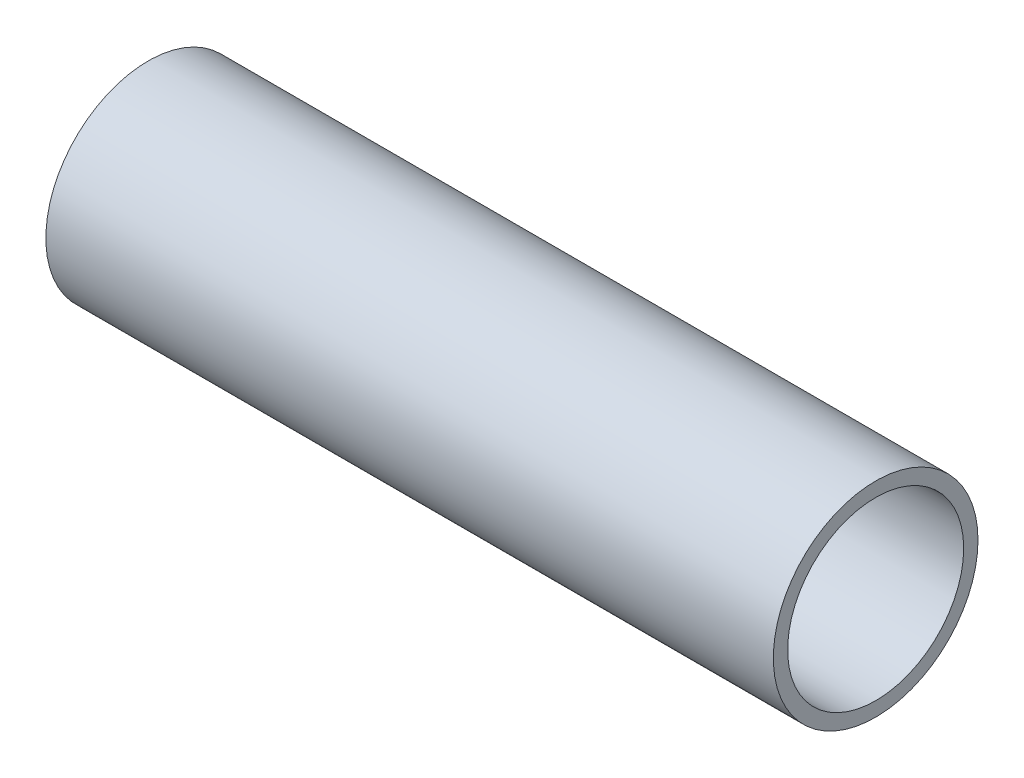
ISO-10303-21;
HEADER;
FILE_DESCRIPTION(('STEP AP214'),'2;1');
FILE_NAME('part.step','',(''),(''),'','','');
FILE_SCHEMA(('AUTOMOTIVE_DESIGN { 1 0 10303 214 1 1 1 1 }'));
ENDSEC;
DATA;
#1=APPLICATION_CONTEXT('core data for automotive mechanical design processes');
#2=APPLICATION_PROTOCOL_DEFINITION('international standard','automotive_design',2000,#1);
#3=PRODUCT_CONTEXT('',#1,'mechanical');
#4=PRODUCT('Part','Part','',(#3));
#5=PRODUCT_RELATED_PRODUCT_CATEGORY('part','',(#4));
#6=PRODUCT_DEFINITION_FORMATION('','',#4);
#7=PRODUCT_DEFINITION_CONTEXT('part definition',#1,'design');
#8=PRODUCT_DEFINITION('design','',#6,#7);
#9=PRODUCT_DEFINITION_SHAPE('','',#8);
#10=(LENGTH_UNIT() NAMED_UNIT(*) SI_UNIT(.MILLI.,.METRE.));
#11=(NAMED_UNIT(*) PLANE_ANGLE_UNIT() SI_UNIT($,.RADIAN.));
#12=(NAMED_UNIT(*) SI_UNIT($,.STERADIAN.) SOLID_ANGLE_UNIT());
#13=UNCERTAINTY_MEASURE_WITH_UNIT(LENGTH_MEASURE(1.E-05),#10,'distance_accuracy_value','');
#14=(GEOMETRIC_REPRESENTATION_CONTEXT(3) GLOBAL_UNCERTAINTY_ASSIGNED_CONTEXT((#13)) GLOBAL_UNIT_ASSIGNED_CONTEXT((#10,
#11,#12)) REPRESENTATION_CONTEXT('',''));
#15=CARTESIAN_POINT('',(0.,0.,0.));
#16=DIRECTION('',(0.,0.,1.));
#17=DIRECTION('',(1.,0.,0.));
#18=AXIS2_PLACEMENT_3D('',#15,#16,#17);
#19=CARTESIAN_POINT('',(150.,0.,0.));
#20=DIRECTION('',(1.,0.,0.));
#21=DIRECTION('',(0.,0.,-1.));
#22=AXIS2_PLACEMENT_3D('',#19,#20,#21);
#23=PLANE('',#22);
#24=CARTESIAN_POINT('',(150.,0.,0.));
#25=DIRECTION('',(1.,0.,0.));
#26=DIRECTION('',(0.,0.,-1.));
#27=AXIS2_PLACEMENT_3D('',#24,#25,#26);
#28=CIRCLE('',#27,21.1);
#29=CARTESIAN_POINT('',(150.,0.,-21.1));
#30=VERTEX_POINT('',#29);
#31=EDGE_CURVE('E10',#30,#30,#28,.T.);
#32=ORIENTED_EDGE('',*,*,#31,.T.);
#33=EDGE_LOOP('',(#32));
#34=FACE_BOUND('',#33,.T.);
#35=CARTESIAN_POINT('',(150.,0.,0.));
#36=DIRECTION('',(1.,0.,0.));
#37=DIRECTION('',(0.,0.,-1.));
#38=AXIS2_PLACEMENT_3D('',#35,#36,#37);
#39=CIRCLE('',#38,18.15);
#40=CARTESIAN_POINT('',(150.,0.,-18.15));
#41=VERTEX_POINT('',#40);
#42=EDGE_CURVE('E46',#41,#41,#39,.T.);
#43=ORIENTED_EDGE('',*,*,#42,.F.);
#44=EDGE_LOOP('',(#43));
#45=FACE_BOUND('',#44,.T.);
#46=ADVANCED_FACE('F35',(#34,#45),#23,.T.);
#47=CARTESIAN_POINT('',(0.,0.,0.));
#48=DIRECTION('',(1.,0.,0.));
#49=DIRECTION('',(0.,0.,-1.));
#50=AXIS2_PLACEMENT_3D('',#47,#48,#49);
#51=PLANE('',#50);
#52=CARTESIAN_POINT('',(0.,0.,0.));
#53=DIRECTION('',(1.,0.,0.));
#54=DIRECTION('',(0.,0.,-1.));
#55=AXIS2_PLACEMENT_3D('',#52,#53,#54);
#56=CIRCLE('',#55,21.1);
#57=CARTESIAN_POINT('',(0.,0.,-21.1));
#58=VERTEX_POINT('',#57);
#59=EDGE_CURVE('E39',#58,#58,#56,.T.);
#60=ORIENTED_EDGE('',*,*,#59,.F.);
#61=EDGE_LOOP('',(#60));
#62=FACE_BOUND('',#61,.T.);
#63=CARTESIAN_POINT('',(0.,0.,0.));
#64=DIRECTION('',(1.,0.,0.));
#65=DIRECTION('',(0.,0.,-1.));
#66=AXIS2_PLACEMENT_3D('',#63,#64,#65);
#67=CIRCLE('',#66,18.15);
#68=CARTESIAN_POINT('',(0.,0.,-18.15));
#69=VERTEX_POINT('',#68);
#70=EDGE_CURVE('E48',#69,#69,#67,.T.);
#71=ORIENTED_EDGE('',*,*,#70,.T.);
#72=EDGE_LOOP('',(#71));
#73=FACE_BOUND('',#72,.T.);
#74=ADVANCED_FACE('F58',(#62,#73),#51,.F.);
#75=CARTESIAN_POINT('',(150.,0.,0.));
#76=DIRECTION('',(-1.,0.,0.));
#77=DIRECTION('',(0.,0.,1.));
#78=AXIS2_PLACEMENT_3D('',#75,#76,#77);
#79=CYLINDRICAL_SURFACE('',#78,21.1);
#80=ORIENTED_EDGE('',*,*,#31,.F.);
#81=EDGE_LOOP('',(#80));
#82=FACE_BOUND('',#81,.T.);
#83=ORIENTED_EDGE('',*,*,#59,.T.);
#84=EDGE_LOOP('',(#83));
#85=FACE_BOUND('',#84,.T.);
#86=ADVANCED_FACE('F37',(#82,#85),#79,.T.);
#87=CARTESIAN_POINT('',(150.,0.,0.));
#88=DIRECTION('',(-1.,0.,0.));
#89=DIRECTION('',(0.,0.,1.));
#90=AXIS2_PLACEMENT_3D('',#87,#88,#89);
#91=CYLINDRICAL_SURFACE('',#90,18.15);
#92=ORIENTED_EDGE('',*,*,#42,.T.);
#93=EDGE_LOOP('',(#92));
#94=FACE_BOUND('',#93,.T.);
#95=ORIENTED_EDGE('',*,*,#70,.F.);
#96=EDGE_LOOP('',(#95));
#97=FACE_BOUND('',#96,.T.);
#98=ADVANCED_FACE('F54',(#94,#97),#91,.F.);
#99=CLOSED_SHELL('',(#46,#74,#86,#98));
#100=MANIFOLD_SOLID_BREP('B2',#99);
#101=ADVANCED_BREP_SHAPE_REPRESENTATION('',(#18,#100),#14);
#102=SHAPE_DEFINITION_REPRESENTATION(#9,#101);
ENDSEC;
END-ISO-10303-21;
